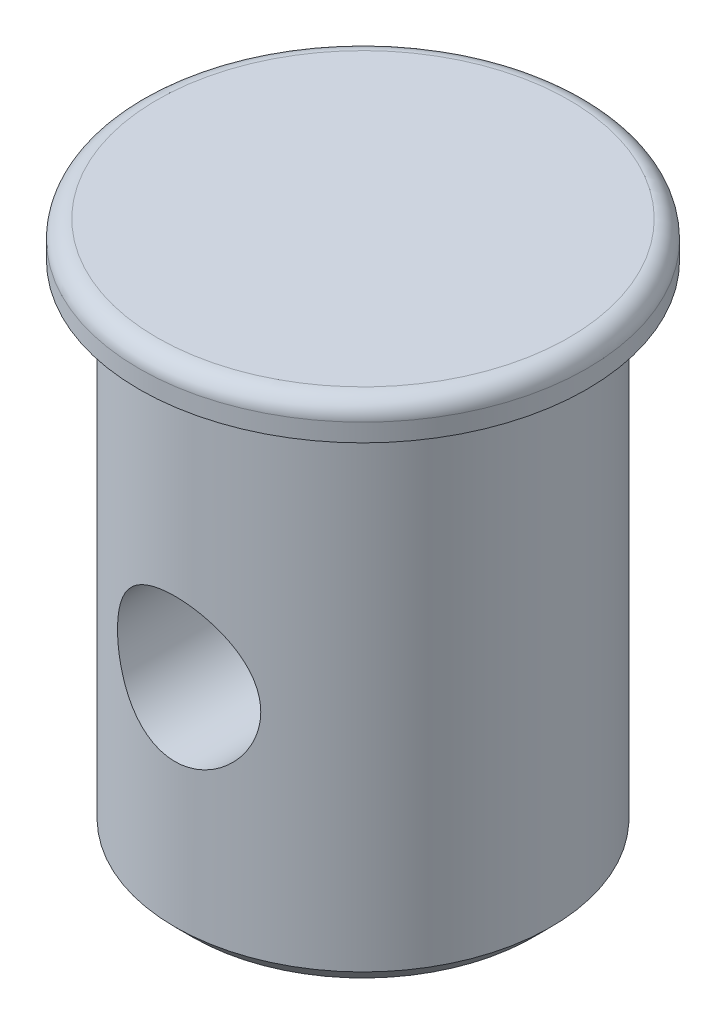
ISO-10303-21;
HEADER;
FILE_DESCRIPTION(('STEP AP214'),'2;1');
FILE_NAME('part.step','',(''),(''),'','','');
FILE_SCHEMA(('AUTOMOTIVE_DESIGN { 1 0 10303 214 1 1 1 1 }'));
ENDSEC;
DATA;
#1=APPLICATION_CONTEXT('core data for automotive mechanical design processes');
#2=APPLICATION_PROTOCOL_DEFINITION('international standard','automotive_design',2000,#1);
#3=PRODUCT_CONTEXT('',#1,'mechanical');
#4=PRODUCT('Part','Part','',(#3));
#5=PRODUCT_RELATED_PRODUCT_CATEGORY('part','',(#4));
#6=PRODUCT_DEFINITION_FORMATION('','',#4);
#7=PRODUCT_DEFINITION_CONTEXT('part definition',#1,'design');
#8=PRODUCT_DEFINITION('design','',#6,#7);
#9=PRODUCT_DEFINITION_SHAPE('','',#8);
#10=(LENGTH_UNIT() NAMED_UNIT(*) SI_UNIT(.MILLI.,.METRE.));
#11=(NAMED_UNIT(*) PLANE_ANGLE_UNIT() SI_UNIT($,.RADIAN.));
#12=(NAMED_UNIT(*) SI_UNIT($,.STERADIAN.) SOLID_ANGLE_UNIT());
#13=UNCERTAINTY_MEASURE_WITH_UNIT(LENGTH_MEASURE(1.E-05),#10,'distance_accuracy_value','');
#14=(GEOMETRIC_REPRESENTATION_CONTEXT(3) GLOBAL_UNCERTAINTY_ASSIGNED_CONTEXT((#13)) GLOBAL_UNIT_ASSIGNED_CONTEXT((#10,
#11,#12)) REPRESENTATION_CONTEXT('',''));
#15=CARTESIAN_POINT('',(0.,0.,0.));
#16=DIRECTION('',(0.,0.,1.));
#17=DIRECTION('',(1.,0.,0.));
#18=AXIS2_PLACEMENT_3D('',#15,#16,#17);
#19=CARTESIAN_POINT('',(0.,28.,0.));
#20=DIRECTION('',(0.,-1.,0.));
#21=DIRECTION('',(0.,0.,-1.));
#22=AXIS2_PLACEMENT_3D('',#19,#20,#21);
#23=CYLINDRICAL_SURFACE('',#22,10.5);
#24=CARTESIAN_POINT('',(0.,17.,-10.5));
#25=CARTESIAN_POINT('',(-0.10816249402773,17.0000005150444,-10.5000003990163));
#26=CARTESIAN_POINT('',(-0.216317226805302,16.9956092681695,-10.498325014305));
#27=CARTESIAN_POINT('',(-0.431849643724886,16.9780899805564,-10.4916697381702));
#28=CARTESIAN_POINT('',(-0.539227073934134,16.9649592043836,-10.4866888121283));
#29=CARTESIAN_POINT('',(-0.752320696488629,16.9300964867436,-10.4735569967627));
#30=CARTESIAN_POINT('',(-0.858037791884634,16.908369402015,-10.4654078974374));
#31=CARTESIAN_POINT('',(-1.0671353505947,16.8565329403734,-10.4461608718977));
#32=CARTESIAN_POINT('',(-1.17051488831636,16.8264203038048,-10.4350617990379));
#33=CARTESIAN_POINT('',(-1.47558283514815,16.724042508179,-10.3978067790511));
#34=CARTESIAN_POINT('',(-1.67285936734757,16.6396281598818,-10.3676498105204));
#35=CARTESIAN_POINT('',(-2.05031727397607,16.4411878776011,-10.299666313908));
#36=CARTESIAN_POINT('',(-2.23049389377237,16.327153740576,-10.2618376618319));
#37=CARTESIAN_POINT('',(-2.57664970318081,16.0674875842774,-10.180554964499));
#38=CARTESIAN_POINT('',(-2.74179208879201,15.9207894427593,-10.1369382145426));
#39=CARTESIAN_POINT('',(-3.04580227070823,15.6022307048775,-10.0497839456605));
#40=CARTESIAN_POINT('',(-3.18466164651555,15.4303620756187,-10.0062464565375));
#41=CARTESIAN_POINT('',(-3.43759067140565,15.0580505873953,-9.92227089475135));
#42=CARTESIAN_POINT('',(-3.55046194725449,14.856746147166,-9.88202363996857));
#43=CARTESIAN_POINT('',(-3.74037141287278,14.4362386628448,-9.81172534045626));
#44=CARTESIAN_POINT('',(-3.81742443699259,14.2170430727797,-9.78167007604848));
#45=CARTESIAN_POINT('',(-3.93017824100957,13.7766341961246,-9.73690200644289));
#46=CARTESIAN_POINT('',(-3.96748208073975,13.5558935959044,-9.72159703172023));
#47=CARTESIAN_POINT('',(-4.00468984551249,13.1107958510282,-9.70633324256615));
#48=CARTESIAN_POINT('',(-4.00460985794797,12.8864403035571,-9.70636782705757));
#49=CARTESIAN_POINT('',(-3.96827544359676,12.4553149514076,-9.72126995333423));
#50=CARTESIAN_POINT('',(-3.93426697528439,12.2483180568447,-9.73521655602861));
#51=CARTESIAN_POINT('',(-3.83476135417431,11.8432273797753,-9.77483723186729));
#52=CARTESIAN_POINT('',(-3.76925930288112,11.6451349875134,-9.80051312934899));
#53=CARTESIAN_POINT('',(-3.60742653694748,11.2589769749522,-9.86123925884152));
#54=CARTESIAN_POINT('',(-3.51052547585192,11.0711785040024,-9.89646077806254));
#55=CARTESIAN_POINT('',(-3.28904350320094,10.7138645896738,-9.97225487445738));
#56=CARTESIAN_POINT('',(-3.16445282285844,10.544355630191,-10.0128293380705));
#57=CARTESIAN_POINT('',(-2.88093153401433,10.2160319347756,-10.098198009063));
#58=CARTESIAN_POINT('',(-2.72021551806992,10.0587803989862,-10.1430894548339));
#59=CARTESIAN_POINT('',(-2.37418548986823,9.77298821982797,-10.2296147927583));
#60=CARTESIAN_POINT('',(-2.18886745928642,9.64445227588805,-10.2712481509886));
#61=CARTESIAN_POINT('',(-1.79480303538511,9.41794135829269,-10.3474418684759));
#62=CARTESIAN_POINT('',(-1.58572200847312,9.32050265996257,-10.3818749104512));
#63=CARTESIAN_POINT('',(-1.15249572744745,9.16270522605319,-10.4388398644991));
#64=CARTESIAN_POINT('',(-0.928357439708987,9.10232947227721,-10.4613772380398));
#65=CARTESIAN_POINT('',(-0.484523009213257,9.02341326082121,-10.4910432028467));
#66=CARTESIAN_POINT('',(-0.265252397194592,9.00276879729815,-10.4989458483901));
#67=CARTESIAN_POINT('',(0.173737961654984,8.99775464981814,-10.5008547488942));
#68=CARTESIAN_POINT('',(0.393457593454625,9.01337661512698,-10.4948642029118));
#69=CARTESIAN_POINT('',(0.81791368609579,9.07886432797596,-10.4701697602295));
#70=CARTESIAN_POINT('',(1.02289813910183,9.12733831539538,-10.4519828724505));
#71=CARTESIAN_POINT('',(1.42166989788425,9.25530734615092,-10.4052481788068));
#72=CARTESIAN_POINT('',(1.61545574573832,9.33480641817741,-10.3766990274081));
#73=CARTESIAN_POINT('',(1.9927891646072,9.52512302117244,-10.3109930092378));
#74=CARTESIAN_POINT('',(2.17586131381993,9.63680108436654,-10.2736055464757));
#75=CARTESIAN_POINT('',(2.52128853254048,9.88733732454646,-10.1943397182704));
#76=CARTESIAN_POINT('',(2.68363574715142,10.0262057566476,-10.1524596611039));
#77=CARTESIAN_POINT('',(2.99318363841575,10.3369615450801,-10.0656958243216));
#78=CARTESIAN_POINT('',(3.13889454803496,10.5103284670112,-10.0207823869792));
#79=CARTESIAN_POINT('',(3.39946665140979,10.8799174370249,-9.93541546836318));
#80=CARTESIAN_POINT('',(3.5143245842607,11.0761418978208,-9.89496245878614));
#81=CARTESIAN_POINT('',(3.71017634656927,11.4877865894829,-9.8232166467957));
#82=CARTESIAN_POINT('',(3.79098632301296,11.7033036052746,-9.79197384330408));
#83=CARTESIAN_POINT('',(3.91461506348578,12.1464156298834,-9.74321766225741));
#84=CARTESIAN_POINT('',(3.95745836544685,12.3740027368118,-9.72569541793324));
#85=CARTESIAN_POINT('',(4.00170805085329,12.8185941351978,-9.70756665590347));
#86=CARTESIAN_POINT('',(4.00566532901142,13.0353040622839,-9.70591893197157));
#87=CARTESIAN_POINT('',(3.97860439692361,13.4661308249143,-9.71704265847931));
#88=CARTESIAN_POINT('',(3.94758972913404,13.6802479208771,-9.72981264848788));
#89=CARTESIAN_POINT('',(3.85347442451017,14.0927282305389,-9.76745395680423));
#90=CARTESIAN_POINT('',(3.7914498042727,14.2913773091394,-9.79191831793501));
#91=CARTESIAN_POINT('',(3.63803895458147,14.6755565960333,-9.84994250999594));
#92=CARTESIAN_POINT('',(3.54664519310975,14.8610834240826,-9.88350467380524));
#93=CARTESIAN_POINT('',(3.33140020609057,15.2245759126208,-9.95818178782136));
#94=CARTESIAN_POINT('',(3.20607159301318,15.4016029949418,-9.99960518617515));
#95=CARTESIAN_POINT('',(2.92880801478986,15.7329127794141,-10.0843001164454));
#96=CARTESIAN_POINT('',(2.77686445734788,15.8871881067342,-10.1275722417784));
#97=CARTESIAN_POINT('',(2.44027354764004,16.1775962048772,-10.2140487965206));
#98=CARTESIAN_POINT('',(2.25426250745181,16.3122092231329,-10.257110957244));
#99=CARTESIAN_POINT('',(1.9593594395281,16.4891432262043,-10.3160576713636));
#100=CARTESIAN_POINT('',(1.85833951741952,16.5439845983214,-10.3347758601238));
#101=CARTESIAN_POINT('',(1.65163041646008,16.6449034298382,-10.3698156858563));
#102=CARTESIAN_POINT('',(1.54594322589825,16.6909845776092,-10.3861383307763));
#103=CARTESIAN_POINT('',(1.32443531685051,16.7763423524983,-10.4167693103109));
#104=CARTESIAN_POINT('',(1.20838133448251,16.8150754495795,-10.4309078828893));
#105=CARTESIAN_POINT('',(0.972896990915018,16.8818086519735,-10.455499775536));
#106=CARTESIAN_POINT('',(0.853468150848938,16.9098135124632,-10.4659547281643));
#107=CARTESIAN_POINT('',(0.612288901104481,16.9547625262345,-10.4828293964664));
#108=CARTESIAN_POINT('',(0.49053896899409,16.9717089300621,-10.4892499331887));
#109=CARTESIAN_POINT('',(0.245855911325709,16.9943266323294,-10.4978347281402));
#110=CARTESIAN_POINT('',(0.122922943626597,16.9999994146698,-10.4999995465317));
#111=CARTESIAN_POINT('',(0.,17.,-10.5));
#112=B_SPLINE_CURVE_WITH_KNOTS('',3,(#24,#25,#26,#27,#28,#29,#30,#31,#32,#33,#34,#35,#36,#37,
#38,#39,#40,#41,#42,#43,#44,#45,#46,#47,#48,#49,#50,#51,#52,#53,#54,#55,#56,#57,#58,#59,#60,#61,
#62,#63,#64,#65,#66,#67,#68,#69,#70,#71,#72,#73,#74,#75,#76,#77,#78,#79,#80,#81,#82,#83,#84,#85,
#86,#87,#88,#89,#90,#91,#92,#93,#94,#95,#96,#97,#98,#99,#100,#101,#102,#103,#104,#105,#106,#107,
#108,#109,#110,#111),.UNSPECIFIED.,.T.,.F.,(4,2,2,2,2,2,2,2,2,2,2,2,2,2,2,2,2,2,2,2,2,2,2,2,2,2,
2,2,2,2,2,2,2,2,2,2,2,2,2,2,2,2,2,4),(0.,0.324371786327613,0.648845147382416,0.973135448801639,
1.29755198566072,1.94440281970489,2.59143298698129,3.26390430627755,3.93659070725503,
4.63589568201203,5.33491077668675,6.00452340011213,6.67384786921408,7.30162176624104,
7.92949333849601,8.56947733254202,9.20968746981433,9.89441427873913,10.5792530641654,
11.2753331376542,11.971093352431,12.6288692357383,13.286493674117,13.9178684674292,
14.5493252737442,15.1995482031768,15.8500168446279,16.5394482941168,17.2289525821686,
17.9221337821842,18.6148666504818,19.2618271918955,19.9087222058254,20.5345843422223,
21.1606071156633,21.8201912873082,22.4799887910923,23.1771058804177,23.52612041901,
23.8749876828147,24.2439123442336,24.6126732939945,24.981359172469,25.3499965191133),.UNSPECIFIED.);
#113=CARTESIAN_POINT('',(0.,17.,-10.5));
#114=VERTEX_POINT('',#113);
#115=EDGE_CURVE('E36',#114,#114,#112,.T.);
#116=ORIENTED_EDGE('',*,*,#115,.T.);
#117=EDGE_LOOP('',(#116));
#118=FACE_BOUND('',#117,.T.);
#119=CARTESIAN_POINT('',(4.,13.,9.7082439194738));
#120=CARTESIAN_POINT('',(4.00000054372853,12.8921603139663,9.70824339067054));
#121=CARTESIAN_POINT('',(3.99563524204198,12.7843285394269,9.71004567763577));
#122=CARTESIAN_POINT('',(3.97822200997141,12.5694512769722,9.71719294571089));
#123=CARTESIAN_POINT('',(3.96517132275507,12.462406049626,9.72253905166389));
#124=CARTESIAN_POINT('',(3.93052677197724,12.2499792552415,9.73659637611283));
#125=CARTESIAN_POINT('',(3.90893680725144,12.1445969517533,9.74530605883501));
#126=CARTESIAN_POINT('',(3.85743772810038,11.9361775295009,9.76580427790091));
#127=CARTESIAN_POINT('',(3.82752531349067,11.8331413586431,9.77759403550418));
#128=CARTESIAN_POINT('',(3.72588291978279,11.5291998246223,9.81698159690898));
#129=CARTESIAN_POINT('',(3.64212123879357,11.3326971270374,9.84865236250674));
#130=CARTESIAN_POINT('',(3.44522497479563,10.9565719860429,9.91923886601531));
#131=CARTESIAN_POINT('',(3.33208127631678,10.7769548047872,9.95815685123987));
#132=CARTESIAN_POINT('',(3.07338071044348,10.4303266818221,10.0410954327823));
#133=CARTESIAN_POINT('',(2.92655729407074,10.2642956496103,10.0852694188439));
#134=CARTESIAN_POINT('',(2.60735786056547,9.95852657294327,10.1724644882787));
#135=CARTESIAN_POINT('',(2.43497618115552,9.81879437044099,10.215485313676));
#136=CARTESIAN_POINT('',(2.06205964085115,9.56480724120128,10.2973572109075));
#137=CARTESIAN_POINT('',(1.860746162205,9.45162492692893,10.336007656815));
#138=CARTESIAN_POINT('',(1.44020262710874,9.26114397160377,10.4029348709252));
#139=CARTESIAN_POINT('',(1.22097903236578,9.18383245554459,10.4312153604223));
#140=CARTESIAN_POINT('',(0.781160107467342,9.07074663070297,10.4731272453472));
#141=CARTESIAN_POINT('',(0.561057301040552,9.03328139407116,10.4873529890931));
#142=CARTESIAN_POINT('',(0.117259432933792,8.9955275760892,10.5016890674317));
#143=CARTESIAN_POINT('',(-0.106434398044415,8.99522651898348,10.5018041388786));
#144=CARTESIAN_POINT('',(-0.538920717489401,9.03083830973471,10.4882801350303));
#145=CARTESIAN_POINT('',(-0.747891101391411,9.06490391078931,10.4753426475605));
#146=CARTESIAN_POINT('',(-1.15689123578795,9.16516660111823,10.4380933268438));
#147=CARTESIAN_POINT('',(-1.35692034994169,9.2313659733558,10.4137806854467));
#148=CARTESIAN_POINT('',(-1.74585655044583,9.39484358502968,10.3557350727207));
#149=CARTESIAN_POINT('',(-1.93455691381379,9.49256438715698,10.3218688737608));
#150=CARTESIAN_POINT('',(-2.29335468167642,9.71591416601681,10.2481278101529));
#151=CARTESIAN_POINT('',(-2.46344595657426,9.84155229730627,10.2082509759005));
#152=CARTESIAN_POINT('',(-2.79105666771594,10.1260052446386,10.1237509361541));
#153=CARTESIAN_POINT('',(-2.94720297998107,10.2863619148853,10.0789865141583));
#154=CARTESIAN_POINT('',(-3.23091572792426,10.6312322336947,9.99165994439756));
#155=CARTESIAN_POINT('',(-3.35847450547995,10.8157523343131,9.94909838908656));
#156=CARTESIAN_POINT('',(-3.58413223795246,11.2092963359737,9.87008983156324));
#157=CARTESIAN_POINT('',(-3.68146687877918,11.4187948729513,9.83381038394379));
#158=CARTESIAN_POINT('',(-3.83894950559362,11.8529570656352,9.77341627620758));
#159=CARTESIAN_POINT('',(-3.89911898284332,12.0776118734895,9.74929458718921));
#160=CARTESIAN_POINT('',(-3.97738944514819,12.522107067419,9.7176162989168));
#161=CARTESIAN_POINT('',(-3.99767876002119,12.7415002489444,9.70919938705788));
#162=CARTESIAN_POINT('',(-4.00194263852667,13.1806698390509,9.70744443907598));
#163=CARTESIAN_POINT('',(-3.98592670211799,13.4004461323463,9.7141024583103));
#164=CARTESIAN_POINT('',(-3.92002093860464,13.8227077945239,9.74087124835065));
#165=CARTESIAN_POINT('',(-3.87185105980963,14.025510057304,9.76029822307358));
#166=CARTESIAN_POINT('',(-3.74518438511283,14.4200514406121,9.80959628529616));
#167=CARTESIAN_POINT('',(-3.66668125592642,14.6117882411652,9.83946955375545));
#168=CARTESIAN_POINT('',(-3.47820379846351,14.9869171402438,9.90769805458208));
#169=CARTESIAN_POINT('',(-3.36714057820063,15.1697095548455,9.94633400918743));
#170=CARTESIAN_POINT('',(-3.1178433055872,15.5148378140092,10.0272731765194));
#171=CARTESIAN_POINT('',(-2.97959903707816,15.6771659291772,10.0695777647719));
#172=CARTESIAN_POINT('',(-2.66910659158355,15.9878422622443,10.1564506117774));
#173=CARTESIAN_POINT('',(-2.4952195750053,16.1345679363279,10.2009846709677));
#174=CARTESIAN_POINT('',(-2.1242048509605,16.396964653573,10.2846424361513));
#175=CARTESIAN_POINT('',(-1.92707688446607,16.5126353505698,10.3237660818331));
#176=CARTESIAN_POINT('',(-1.51512716903534,16.7089456266229,10.3921995459406));
#177=CARTESIAN_POINT('',(-1.3003563825358,16.7896821561234,10.4215364722192));
#178=CARTESIAN_POINT('',(-0.858904253003719,16.9134077152348,10.4671588824716));
#179=CARTESIAN_POINT('',(-0.632228766531707,16.9564151248373,10.4834507211088));
#180=CARTESIAN_POINT('',(-0.18804372291293,17.0014325966749,10.5005273628021));
#181=CARTESIAN_POINT('',(0.0292010061861908,17.0057451910003,10.5021829987447));
#182=CARTESIAN_POINT('',(0.461192195076527,16.9792103199497,10.4920903755246));
#183=CARTESIAN_POINT('',(0.675938969176521,16.9483673274953,10.4803438215515));
#184=CARTESIAN_POINT('',(1.09119492791433,16.8540212329206,10.4451732404887));
#185=CARTESIAN_POINT('',(1.29192854770838,16.7913818284586,10.4220585035856));
#186=CARTESIAN_POINT('',(1.68004036242689,16.6360942440656,10.3665778349624));
#187=CARTESIAN_POINT('',(1.86741601955185,16.5434403803057,10.3342101511511));
#188=CARTESIAN_POINT('',(2.23225238241283,16.3262609978753,10.2617307322745));
#189=CARTESIAN_POINT('',(2.40895007055608,16.2005453365633,10.221347724863));
#190=CARTESIAN_POINT('',(2.7394309521329,15.9227032205179,10.1377822390342));
#191=CARTESIAN_POINT('',(2.89320582885866,15.7705672232585,10.0945987526799));
#192=CARTESIAN_POINT('',(3.1822465521201,15.4341429953575,10.0073649817145));
#193=CARTESIAN_POINT('',(3.31603359848739,15.2485485065431,9.96339717507828));
#194=CARTESIAN_POINT('',(3.49187108837957,14.9544681606551,9.90256003621263));
#195=CARTESIAN_POINT('',(3.54637098911131,14.8537545152988,9.88312221455878));
#196=CARTESIAN_POINT('',(3.64666947518819,14.6476978828197,9.84655514931103));
#197=CARTESIAN_POINT('',(3.69247173927472,14.5423568761979,9.82942493059127));
#198=CARTESIAN_POINT('',(3.77736392176237,14.3214867880704,9.79712755396004));
#199=CARTESIAN_POINT('',(3.81590682046159,14.2057217865681,9.78213307052439));
#200=CARTESIAN_POINT('',(3.88232370758721,13.9707999209058,9.75596424582135));
#201=CARTESIAN_POINT('',(3.91020255937971,13.8516446295978,9.74478816341131));
#202=CARTESIAN_POINT('',(3.95495190171401,13.6110054669541,9.72671268530884));
#203=CARTESIAN_POINT('',(3.97182630957147,13.4895224401054,9.71981176780501));
#204=CARTESIAN_POINT('',(3.99434928189202,13.2453560853353,9.71057799799701));
#205=CARTESIAN_POINT('',(3.99999938148217,13.122672923861,9.70824452101341));
#206=CARTESIAN_POINT('',(4.,13.,9.7082439194738));
#207=B_SPLINE_CURVE_WITH_KNOTS('',3,(#119,#120,#121,#122,#123,#124,#125,#126,#127,#128,#129,
#130,#131,#132,#133,#134,#135,#136,#137,#138,#139,#140,#141,#142,#143,#144,#145,#146,#147,#148,
#149,#150,#151,#152,#153,#154,#155,#156,#157,#158,#159,#160,#161,#162,#163,#164,#165,#166,#167,
#168,#169,#170,#171,#172,#173,#174,#175,#176,#177,#178,#179,#180,#181,#182,#183,#184,#185,#186,
#187,#188,#189,#190,#191,#192,#193,#194,#195,#196,#197,#198,#199,#200,#201,#202,#203,#204,#205,
#206),.UNSPECIFIED.,.T.,.F.,(4,2,2,2,2,2,2,2,2,2,2,2,2,2,2,2,2,2,2,2,2,2,2,2,2,2,2,2,2,2,2,2,2,
2,2,2,2,2,2,2,2,2,2,4),(0.,0.32340195250673,0.646906605168967,0.970263723314499,
1.29374924869829,1.93841971950198,2.58329043215359,3.25826503503675,3.93338939849305,
4.63232933181253,5.33101820211571,5.99870373055713,6.66616512101903,7.29956530734275,
7.93301050055433,8.57576752000207,9.21873562203776,9.90040810252802,10.5822629739786,
11.2801715067432,11.9776760856407,12.6357017136697,13.2935551766665,13.9187716586688,
14.5441187503274,15.1933847200921,15.842895188439,16.5351405836722,17.2273936949335,
17.9177131245886,18.6076960734956,19.2563278305621,19.9048770700111,20.5366835806881,
21.168609806379,21.8274707088206,22.4865700761779,23.1818386414171,23.5299354934321,
23.8778847853036,24.2461198988097,24.6141868769516,24.9821227605352,25.3500083187697),.UNSPECIFIED.);
#208=CARTESIAN_POINT('',(4.,13.,9.7082439194738));
#209=VERTEX_POINT('',#208);
#210=EDGE_CURVE('E53',#209,#209,#207,.T.);
#211=ORIENTED_EDGE('',*,*,#210,.T.);
#212=EDGE_LOOP('',(#211));
#213=FACE_BOUND('',#212,.T.);
#214=CARTESIAN_POINT('',(0.,1.00000000000001,0.));
#215=DIRECTION('',(0.,1.,0.));
#216=DIRECTION('',(0.,0.,1.));
#217=AXIS2_PLACEMENT_3D('',#214,#215,#216);
#218=CIRCLE('',#217,10.5);
#219=CARTESIAN_POINT('',(0.,1.00000000000001,10.5));
#220=VERTEX_POINT('',#219);
#221=EDGE_CURVE('E45',#220,#220,#218,.T.);
#222=ORIENTED_EDGE('',*,*,#221,.T.);
#223=EDGE_LOOP('',(#222));
#224=FACE_BOUND('',#223,.T.);
#225=CARTESIAN_POINT('',(0.,28.,0.));
#226=DIRECTION('',(0.,1.,0.));
#227=DIRECTION('',(0.,0.,1.));
#228=AXIS2_PLACEMENT_3D('',#225,#226,#227);
#229=CIRCLE('',#228,10.5);
#230=CARTESIAN_POINT('',(0.,28.,10.5));
#231=VERTEX_POINT('',#230);
#232=EDGE_CURVE('E95',#231,#231,#229,.T.);
#233=ORIENTED_EDGE('',*,*,#232,.F.);
#234=EDGE_LOOP('',(#233));
#235=FACE_BOUND('',#234,.T.);
#236=ADVANCED_FACE('F32',(#118,#213,#224,#235),#23,.T.);
#237=CARTESIAN_POINT('',(0.,0.,0.));
#238=DIRECTION('',(0.,1.,0.));
#239=DIRECTION('',(0.,0.,1.));
#240=AXIS2_PLACEMENT_3D('',#237,#238,#239);
#241=PLANE('',#240);
#242=CARTESIAN_POINT('',(0.,0.,0.));
#243=DIRECTION('',(0.,1.,0.));
#244=DIRECTION('',(0.,0.,1.));
#245=AXIS2_PLACEMENT_3D('',#242,#243,#244);
#246=CIRCLE('',#245,9.49999999999999);
#247=CARTESIAN_POINT('',(0.,0.,9.49999999999999));
#248=VERTEX_POINT('',#247);
#249=EDGE_CURVE('E10',#248,#248,#246,.F.);
#250=ORIENTED_EDGE('',*,*,#249,.T.);
#251=EDGE_LOOP('',(#250));
#252=FACE_BOUND('',#251,.T.);
#253=ADVANCED_FACE('F77',(#252),#241,.F.);
#254=CARTESIAN_POINT('',(0.,30.,0.));
#255=DIRECTION('',(0.,-1.,0.));
#256=DIRECTION('',(0.,0.,-1.));
#257=AXIS2_PLACEMENT_3D('',#254,#255,#256);
#258=CYLINDRICAL_SURFACE('',#257,12.5);
#259=CARTESIAN_POINT('',(0.,29.,0.));
#260=DIRECTION('',(0.,1.,0.));
#261=DIRECTION('',(0.,0.,1.));
#262=AXIS2_PLACEMENT_3D('',#259,#260,#261);
#263=CIRCLE('',#262,12.5);
#264=CARTESIAN_POINT('',(0.,29.,12.5));
#265=VERTEX_POINT('',#264);
#266=EDGE_CURVE('E50',#265,#265,#263,.F.);
#267=ORIENTED_EDGE('',*,*,#266,.T.);
#268=EDGE_LOOP('',(#267));
#269=FACE_BOUND('',#268,.T.);
#270=CARTESIAN_POINT('',(0.,28.,0.));
#271=DIRECTION('',(0.,1.,0.));
#272=DIRECTION('',(0.,0.,1.));
#273=AXIS2_PLACEMENT_3D('',#270,#271,#272);
#274=CIRCLE('',#273,12.5);
#275=CARTESIAN_POINT('',(0.,28.,12.5));
#276=VERTEX_POINT('',#275);
#277=EDGE_CURVE('E97',#276,#276,#274,.T.);
#278=ORIENTED_EDGE('',*,*,#277,.T.);
#279=EDGE_LOOP('',(#278));
#280=FACE_BOUND('',#279,.T.);
#281=ADVANCED_FACE('F70',(#269,#280),#258,.T.);
#282=CARTESIAN_POINT('',(0.,30.,0.));
#283=DIRECTION('',(0.,1.,0.));
#284=DIRECTION('',(0.,0.,1.));
#285=AXIS2_PLACEMENT_3D('',#282,#283,#284);
#286=PLANE('',#285);
#287=CARTESIAN_POINT('',(0.,30.,0.));
#288=DIRECTION('',(0.,1.,0.));
#289=DIRECTION('',(0.,0.,1.));
#290=AXIS2_PLACEMENT_3D('',#287,#288,#289);
#291=CIRCLE('',#290,11.5);
#292=CARTESIAN_POINT('',(0.,30.,11.5));
#293=VERTEX_POINT('',#292);
#294=EDGE_CURVE('E96',#293,#293,#291,.T.);
#295=ORIENTED_EDGE('',*,*,#294,.T.);
#296=EDGE_LOOP('',(#295));
#297=FACE_BOUND('',#296,.T.);
#298=ADVANCED_FACE('F65',(#297),#286,.T.);
#299=CARTESIAN_POINT('',(0.,28.,0.));
#300=DIRECTION('',(0.,1.,0.));
#301=DIRECTION('',(0.,0.,1.));
#302=AXIS2_PLACEMENT_3D('',#299,#300,#301);
#303=PLANE('',#302);
#304=ORIENTED_EDGE('',*,*,#232,.T.);
#305=EDGE_LOOP('',(#304));
#306=FACE_BOUND('',#305,.T.);
#307=ORIENTED_EDGE('',*,*,#277,.F.);
#308=EDGE_LOOP('',(#307));
#309=FACE_BOUND('',#308,.T.);
#310=ADVANCED_FACE('F69',(#306,#309),#303,.F.);
#311=CARTESIAN_POINT('',(0.,29.,0.));
#312=DIRECTION('',(0.,1.,0.));
#313=DIRECTION('',(0.,0.,1.));
#314=AXIS2_PLACEMENT_3D('',#311,#312,#313);
#315=TOROIDAL_SURFACE('',#314,11.5,1.);
#316=ORIENTED_EDGE('',*,*,#266,.F.);
#317=EDGE_LOOP('',(#316));
#318=FACE_BOUND('',#317,.T.);
#319=ORIENTED_EDGE('',*,*,#294,.F.);
#320=EDGE_LOOP('',(#319));
#321=FACE_BOUND('',#320,.T.);
#322=ADVANCED_FACE('F74',(#318,#321),#315,.T.);
#323=CARTESIAN_POINT('',(0.,1.00000000000001,0.));
#324=DIRECTION('',(0.,1.,0.));
#325=DIRECTION('',(0.,0.,1.));
#326=AXIS2_PLACEMENT_3D('',#323,#324,#325);
#327=CONICAL_SURFACE('',#326,10.5,0.78539816339745);
#328=ORIENTED_EDGE('',*,*,#249,.F.);
#329=EDGE_LOOP('',(#328));
#330=FACE_BOUND('',#329,.T.);
#331=ORIENTED_EDGE('',*,*,#221,.F.);
#332=EDGE_LOOP('',(#331));
#333=FACE_BOUND('',#332,.T.);
#334=ADVANCED_FACE('F34',(#330,#333),#327,.T.);
#335=CARTESIAN_POINT('',(0.,13.,-12.5));
#336=DIRECTION('',(0.,0.,1.));
#337=DIRECTION('',(1.,0.,0.));
#338=AXIS2_PLACEMENT_3D('',#335,#336,#337);
#339=CYLINDRICAL_SURFACE('',#338,4.);
#340=ORIENTED_EDGE('',*,*,#210,.F.);
#341=EDGE_LOOP('',(#340));
#342=FACE_BOUND('',#341,.T.);
#343=ORIENTED_EDGE('',*,*,#115,.F.);
#344=EDGE_LOOP('',(#343));
#345=FACE_BOUND('',#344,.T.);
#346=ADVANCED_FACE('F60',(#342,#345),#339,.F.);
#347=CLOSED_SHELL('',(#236,#253,#281,#298,#310,#322,#334,#346));
#348=MANIFOLD_SOLID_BREP('B2',#347);
#349=ADVANCED_BREP_SHAPE_REPRESENTATION('',(#18,#348),#14);
#350=SHAPE_DEFINITION_REPRESENTATION(#9,#349);
ENDSEC;
END-ISO-10303-21;
